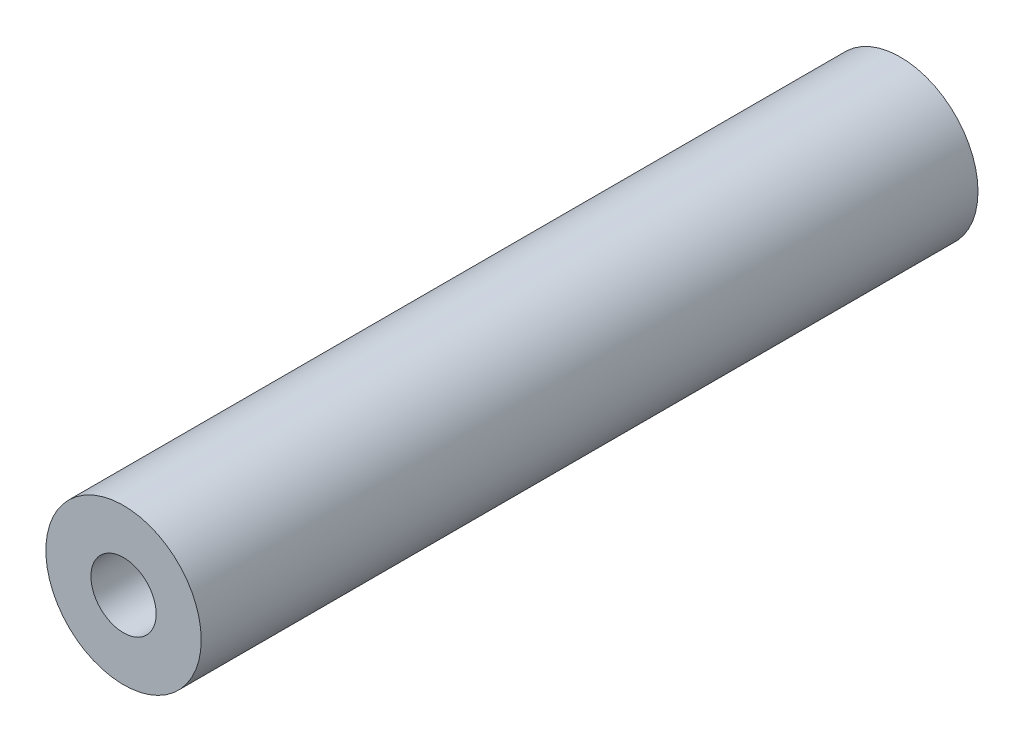
ISO-10303-21;
HEADER;
FILE_DESCRIPTION(('STEP AP214'),'2;1');
FILE_NAME('part.step','',(''),(''),'','','');
FILE_SCHEMA(('AUTOMOTIVE_DESIGN { 1 0 10303 214 1 1 1 1 }'));
ENDSEC;
DATA;
#1=APPLICATION_CONTEXT('core data for automotive mechanical design processes');
#2=APPLICATION_PROTOCOL_DEFINITION('international standard','automotive_design',2000,#1);
#3=PRODUCT_CONTEXT('',#1,'mechanical');
#4=PRODUCT('Part','Part','',(#3));
#5=PRODUCT_RELATED_PRODUCT_CATEGORY('part','',(#4));
#6=PRODUCT_DEFINITION_FORMATION('','',#4);
#7=PRODUCT_DEFINITION_CONTEXT('part definition',#1,'design');
#8=PRODUCT_DEFINITION('design','',#6,#7);
#9=PRODUCT_DEFINITION_SHAPE('','',#8);
#10=(LENGTH_UNIT() NAMED_UNIT(*) SI_UNIT(.MILLI.,.METRE.));
#11=(NAMED_UNIT(*) PLANE_ANGLE_UNIT() SI_UNIT($,.RADIAN.));
#12=(NAMED_UNIT(*) SI_UNIT($,.STERADIAN.) SOLID_ANGLE_UNIT());
#13=UNCERTAINTY_MEASURE_WITH_UNIT(LENGTH_MEASURE(1.E-05),#10,'distance_accuracy_value','');
#14=(GEOMETRIC_REPRESENTATION_CONTEXT(3) GLOBAL_UNCERTAINTY_ASSIGNED_CONTEXT((#13)) GLOBAL_UNIT_ASSIGNED_CONTEXT((#10,
#11,#12)) REPRESENTATION_CONTEXT('',''));
#15=CARTESIAN_POINT('',(0.,0.,0.));
#16=DIRECTION('',(0.,0.,1.));
#17=DIRECTION('',(1.,0.,0.));
#18=AXIS2_PLACEMENT_3D('',#15,#16,#17);
#19=CARTESIAN_POINT('',(0.,0.,50.));
#20=DIRECTION('',(0.,0.,-1.));
#21=DIRECTION('',(-1.,0.,0.));
#22=AXIS2_PLACEMENT_3D('',#19,#20,#21);
#23=CYLINDRICAL_SURFACE('',#22,5.);
#24=CARTESIAN_POINT('',(0.,0.,50.));
#25=DIRECTION('',(0.,0.,1.));
#26=DIRECTION('',(1.,0.,0.));
#27=AXIS2_PLACEMENT_3D('',#24,#25,#26);
#28=CIRCLE('',#27,5.);
#29=CARTESIAN_POINT('',(5.,0.,50.));
#30=VERTEX_POINT('',#29);
#31=EDGE_CURVE('E10',#30,#30,#28,.T.);
#32=ORIENTED_EDGE('',*,*,#31,.F.);
#33=EDGE_LOOP('',(#32));
#34=FACE_BOUND('',#33,.T.);
#35=CARTESIAN_POINT('',(0.,0.,0.));
#36=DIRECTION('',(0.,0.,1.));
#37=DIRECTION('',(1.,0.,0.));
#38=AXIS2_PLACEMENT_3D('',#35,#36,#37);
#39=CIRCLE('',#38,5.);
#40=CARTESIAN_POINT('',(5.,0.,0.));
#41=VERTEX_POINT('',#40);
#42=EDGE_CURVE('E37',#41,#41,#39,.T.);
#43=ORIENTED_EDGE('',*,*,#42,.T.);
#44=EDGE_LOOP('',(#43));
#45=FACE_BOUND('',#44,.T.);
#46=ADVANCED_FACE('F34',(#34,#45),#23,.T.);
#47=CARTESIAN_POINT('',(0.,0.,50.));
#48=DIRECTION('',(0.,0.,1.));
#49=DIRECTION('',(1.,0.,0.));
#50=AXIS2_PLACEMENT_3D('',#47,#48,#49);
#51=PLANE('',#50);
#52=CARTESIAN_POINT('',(0.,0.,50.));
#53=DIRECTION('',(0.,0.,1.));
#54=DIRECTION('',(1.,0.,0.));
#55=AXIS2_PLACEMENT_3D('',#52,#53,#54);
#56=CIRCLE('',#55,2.09999999999999);
#57=CARTESIAN_POINT('',(2.09999999999999,0.,50.));
#58=VERTEX_POINT('',#57);
#59=EDGE_CURVE('E48',#58,#58,#56,.T.);
#60=ORIENTED_EDGE('',*,*,#59,.F.);
#61=EDGE_LOOP('',(#60));
#62=FACE_BOUND('',#61,.T.);
#63=ORIENTED_EDGE('',*,*,#31,.T.);
#64=EDGE_LOOP('',(#63));
#65=FACE_BOUND('',#64,.T.);
#66=ADVANCED_FACE('F54',(#62,#65),#51,.T.);
#67=CARTESIAN_POINT('',(0.,0.,0.));
#68=DIRECTION('',(0.,0.,1.));
#69=DIRECTION('',(1.,0.,0.));
#70=AXIS2_PLACEMENT_3D('',#67,#68,#69);
#71=PLANE('',#70);
#72=CARTESIAN_POINT('',(0.,0.,0.));
#73=DIRECTION('',(0.,0.,1.));
#74=DIRECTION('',(1.,0.,0.));
#75=AXIS2_PLACEMENT_3D('',#72,#73,#74);
#76=CIRCLE('',#75,2.09999999999999);
#77=CARTESIAN_POINT('',(2.09999999999999,0.,0.));
#78=VERTEX_POINT('',#77);
#79=EDGE_CURVE('E44',#78,#78,#76,.T.);
#80=ORIENTED_EDGE('',*,*,#79,.T.);
#81=EDGE_LOOP('',(#80));
#82=FACE_BOUND('',#81,.T.);
#83=ORIENTED_EDGE('',*,*,#42,.F.);
#84=EDGE_LOOP('',(#83));
#85=FACE_BOUND('',#84,.T.);
#86=ADVANCED_FACE('F56',(#82,#85),#71,.F.);
#87=CARTESIAN_POINT('',(0.,0.,50.));
#88=DIRECTION('',(0.,0.,1.));
#89=DIRECTION('',(1.,0.,0.));
#90=AXIS2_PLACEMENT_3D('',#87,#88,#89);
#91=CYLINDRICAL_SURFACE('',#90,2.09999999999999);
#92=ORIENTED_EDGE('',*,*,#79,.F.);
#93=EDGE_LOOP('',(#92));
#94=FACE_BOUND('',#93,.T.);
#95=ORIENTED_EDGE('',*,*,#59,.T.);
#96=EDGE_LOOP('',(#95));
#97=FACE_BOUND('',#96,.T.);
#98=ADVANCED_FACE('F52',(#94,#97),#91,.F.);
#99=CLOSED_SHELL('',(#46,#66,#86,#98));
#100=MANIFOLD_SOLID_BREP('B2',#99);
#101=ADVANCED_BREP_SHAPE_REPRESENTATION('',(#18,#100),#14);
#102=SHAPE_DEFINITION_REPRESENTATION(#9,#101);
ENDSEC;
END-ISO-10303-21;
